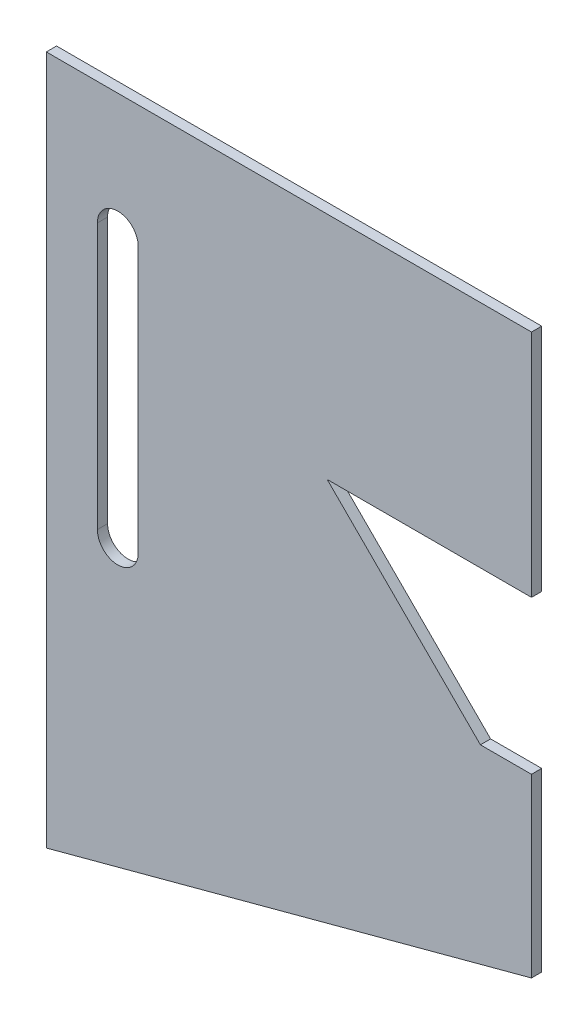
ISO-10303-21;
HEADER;
FILE_DESCRIPTION(('STEP AP214'),'2;1');
FILE_NAME('part.step','',(''),(''),'','','');
FILE_SCHEMA(('AUTOMOTIVE_DESIGN { 1 0 10303 214 1 1 1 1 }'));
ENDSEC;
DATA;
#1=APPLICATION_CONTEXT('core data for automotive mechanical design processes');
#2=APPLICATION_PROTOCOL_DEFINITION('international standard','automotive_design',2000,#1);
#3=PRODUCT_CONTEXT('',#1,'mechanical');
#4=PRODUCT('Part','Part','',(#3));
#5=PRODUCT_RELATED_PRODUCT_CATEGORY('part','',(#4));
#6=PRODUCT_DEFINITION_FORMATION('','',#4);
#7=PRODUCT_DEFINITION_CONTEXT('part definition',#1,'design');
#8=PRODUCT_DEFINITION('design','',#6,#7);
#9=PRODUCT_DEFINITION_SHAPE('','',#8);
#10=(LENGTH_UNIT() NAMED_UNIT(*) SI_UNIT(.MILLI.,.METRE.));
#11=(NAMED_UNIT(*) PLANE_ANGLE_UNIT() SI_UNIT($,.RADIAN.));
#12=(NAMED_UNIT(*) SI_UNIT($,.STERADIAN.) SOLID_ANGLE_UNIT());
#13=UNCERTAINTY_MEASURE_WITH_UNIT(LENGTH_MEASURE(1.E-05),#10,'distance_accuracy_value','');
#14=(GEOMETRIC_REPRESENTATION_CONTEXT(3) GLOBAL_UNCERTAINTY_ASSIGNED_CONTEXT((#13)) GLOBAL_UNIT_ASSIGNED_CONTEXT((#10,
#11,#12)) REPRESENTATION_CONTEXT('',''));
#15=CARTESIAN_POINT('',(0.,0.,0.));
#16=DIRECTION('',(0.,0.,1.));
#17=DIRECTION('',(1.,0.,0.));
#18=AXIS2_PLACEMENT_3D('',#15,#16,#17);
#19=CARTESIAN_POINT('',(0.,0.,2.));
#20=DIRECTION('',(0.,0.,-1.));
#21=DIRECTION('',(-1.,0.,0.));
#22=AXIS2_PLACEMENT_3D('',#19,#20,#21);
#23=PLANE('',#22);
#24=DIRECTION('',(0.,-1.,0.));
#25=VECTOR('',#24,1.);
#26=CARTESIAN_POINT('',(0.,135.,2.));
#27=LINE('',#26,#25);
#28=CARTESIAN_POINT('',(0.,135.,2.));
#29=VERTEX_POINT('',#28);
#30=CARTESIAN_POINT('',(0.,0.,2.));
#31=VERTEX_POINT('',#30);
#32=EDGE_CURVE('E158',#29,#31,#27,.T.);
#33=ORIENTED_EDGE('',*,*,#32,.T.);
#34=DIRECTION('',(0.965925826289067,0.258819045102525,0.));
#35=VECTOR('',#34,1.);
#36=CARTESIAN_POINT('',(0.,0.,2.));
#37=LINE('',#36,#35);
#38=CARTESIAN_POINT('',(95.,25.4551732809571,2.));
#39=VERTEX_POINT('',#38);
#40=EDGE_CURVE('E161',#31,#39,#37,.T.);
#41=ORIENTED_EDGE('',*,*,#40,.T.);
#42=DIRECTION('',(0.,1.,0.));
#43=VECTOR('',#42,1.);
#44=CARTESIAN_POINT('',(95.,25.4551732809571,2.));
#45=LINE('',#44,#43);
#46=CARTESIAN_POINT('',(95.,60.,2.));
#47=VERTEX_POINT('',#46);
#48=EDGE_CURVE('E164',#39,#47,#45,.T.);
#49=ORIENTED_EDGE('',*,*,#48,.T.);
#50=DIRECTION('',(-1.,0.,0.));
#51=VECTOR('',#50,1.);
#52=CARTESIAN_POINT('',(95.,60.,2.));
#53=LINE('',#52,#51);
#54=CARTESIAN_POINT('',(85.,60.,2.));
#55=VERTEX_POINT('',#54);
#56=EDGE_CURVE('E166',#47,#55,#53,.T.);
#57=ORIENTED_EDGE('',*,*,#56,.T.);
#58=DIRECTION('',(-0.707106781186548,0.707106781186547,0.));
#59=VECTOR('',#58,1.);
#60=CARTESIAN_POINT('',(85.,60.,2.));
#61=LINE('',#60,#59);
#62=CARTESIAN_POINT('',(55.,90.,2.));
#63=VERTEX_POINT('',#62);
#64=EDGE_CURVE('E168',#55,#63,#61,.T.);
#65=ORIENTED_EDGE('',*,*,#64,.T.);
#66=DIRECTION('',(1.,0.,0.));
#67=VECTOR('',#66,1.);
#68=CARTESIAN_POINT('',(55.,90.,2.));
#69=LINE('',#68,#67);
#70=CARTESIAN_POINT('',(95.,90.,2.));
#71=VERTEX_POINT('',#70);
#72=EDGE_CURVE('E170',#63,#71,#69,.T.);
#73=ORIENTED_EDGE('',*,*,#72,.T.);
#74=DIRECTION('',(0.,1.,0.));
#75=VECTOR('',#74,1.);
#76=CARTESIAN_POINT('',(95.,90.,2.));
#77=LINE('',#76,#75);
#78=CARTESIAN_POINT('',(95.,135.,2.));
#79=VERTEX_POINT('',#78);
#80=EDGE_CURVE('E172',#71,#79,#77,.T.);
#81=ORIENTED_EDGE('',*,*,#80,.T.);
#82=DIRECTION('',(-1.,0.,0.));
#83=VECTOR('',#82,1.);
#84=CARTESIAN_POINT('',(95.,135.,2.));
#85=LINE('',#84,#83);
#86=EDGE_CURVE('E174',#79,#29,#85,.T.);
#87=ORIENTED_EDGE('',*,*,#86,.T.);
#88=EDGE_LOOP('',(#33,#41,#49,#57,#65,#73,#81,#87));
#89=FACE_BOUND('',#88,.T.);
#90=CARTESIAN_POINT('',(14.,111.,2.));
#91=DIRECTION('',(0.,0.,1.));
#92=DIRECTION('',(1.,0.,0.));
#93=AXIS2_PLACEMENT_3D('',#90,#91,#92);
#94=CIRCLE('',#93,4.);
#95=CARTESIAN_POINT('',(18.,111.,2.));
#96=VERTEX_POINT('',#95);
#97=CARTESIAN_POINT('',(10.,111.,2.));
#98=VERTEX_POINT('',#97);
#99=EDGE_CURVE('E122',#96,#98,#94,.T.);
#100=ORIENTED_EDGE('',*,*,#99,.F.);
#101=DIRECTION('',(0.,1.,0.));
#102=VECTOR('',#101,1.);
#103=CARTESIAN_POINT('',(18.,111.,2.));
#104=LINE('',#103,#102);
#105=CARTESIAN_POINT('',(18.,59.,2.));
#106=VERTEX_POINT('',#105);
#107=EDGE_CURVE('E144',#106,#96,#104,.T.);
#108=ORIENTED_EDGE('',*,*,#107,.F.);
#109=CARTESIAN_POINT('',(14.,59.,2.));
#110=DIRECTION('',(0.,0.,1.));
#111=DIRECTION('',(1.,0.,0.));
#112=AXIS2_PLACEMENT_3D('',#109,#110,#111);
#113=CIRCLE('',#112,4.);
#114=CARTESIAN_POINT('',(10.,59.,2.));
#115=VERTEX_POINT('',#114);
#116=EDGE_CURVE('E142',#115,#106,#113,.T.);
#117=ORIENTED_EDGE('',*,*,#116,.F.);
#118=DIRECTION('',(0.,-1.,0.));
#119=VECTOR('',#118,1.);
#120=CARTESIAN_POINT('',(10.,111.,2.));
#121=LINE('',#120,#119);
#122=EDGE_CURVE('E130',#98,#115,#121,.T.);
#123=ORIENTED_EDGE('',*,*,#122,.F.);
#124=EDGE_LOOP('',(#100,#108,#117,#123));
#125=FACE_BOUND('',#124,.T.);
#126=ADVANCED_FACE('F33',(#89,#125),#23,.F.);
#127=CARTESIAN_POINT('',(0.,0.,0.));
#128=DIRECTION('',(0.,0.,-1.));
#129=DIRECTION('',(-1.,0.,0.));
#130=AXIS2_PLACEMENT_3D('',#127,#128,#129);
#131=PLANE('',#130);
#132=DIRECTION('',(0.,-1.,0.));
#133=VECTOR('',#132,1.);
#134=CARTESIAN_POINT('',(0.,135.,0.));
#135=LINE('',#134,#133);
#136=CARTESIAN_POINT('',(0.,135.,0.));
#137=VERTEX_POINT('',#136);
#138=CARTESIAN_POINT('',(0.,0.,0.));
#139=VERTEX_POINT('',#138);
#140=EDGE_CURVE('E138',#137,#139,#135,.T.);
#141=ORIENTED_EDGE('',*,*,#140,.F.);
#142=DIRECTION('',(-1.,0.,0.));
#143=VECTOR('',#142,1.);
#144=CARTESIAN_POINT('',(95.,135.,0.));
#145=LINE('',#144,#143);
#146=CARTESIAN_POINT('',(95.,135.,0.));
#147=VERTEX_POINT('',#146);
#148=EDGE_CURVE('E162',#147,#137,#145,.T.);
#149=ORIENTED_EDGE('',*,*,#148,.F.);
#150=DIRECTION('',(0.,1.,0.));
#151=VECTOR('',#150,1.);
#152=CARTESIAN_POINT('',(95.,90.,0.));
#153=LINE('',#152,#151);
#154=CARTESIAN_POINT('',(95.,90.,0.));
#155=VERTEX_POINT('',#154);
#156=EDGE_CURVE('E189',#155,#147,#153,.T.);
#157=ORIENTED_EDGE('',*,*,#156,.F.);
#158=DIRECTION('',(1.,0.,0.));
#159=VECTOR('',#158,1.);
#160=CARTESIAN_POINT('',(55.,90.,0.));
#161=LINE('',#160,#159);
#162=CARTESIAN_POINT('',(55.,90.,0.));
#163=VERTEX_POINT('',#162);
#164=EDGE_CURVE('E187',#163,#155,#161,.T.);
#165=ORIENTED_EDGE('',*,*,#164,.F.);
#166=DIRECTION('',(-0.707106781186548,0.707106781186547,0.));
#167=VECTOR('',#166,1.);
#168=CARTESIAN_POINT('',(85.,60.,0.));
#169=LINE('',#168,#167);
#170=CARTESIAN_POINT('',(85.,60.,0.));
#171=VERTEX_POINT('',#170);
#172=EDGE_CURVE('E185',#171,#163,#169,.T.);
#173=ORIENTED_EDGE('',*,*,#172,.F.);
#174=DIRECTION('',(-1.,0.,0.));
#175=VECTOR('',#174,1.);
#176=CARTESIAN_POINT('',(95.,60.,0.));
#177=LINE('',#176,#175);
#178=CARTESIAN_POINT('',(95.,60.,0.));
#179=VERTEX_POINT('',#178);
#180=EDGE_CURVE('E183',#179,#171,#177,.T.);
#181=ORIENTED_EDGE('',*,*,#180,.F.);
#182=DIRECTION('',(0.,1.,0.));
#183=VECTOR('',#182,1.);
#184=CARTESIAN_POINT('',(95.,25.4551732809571,0.));
#185=LINE('',#184,#183);
#186=CARTESIAN_POINT('',(95.,25.4551732809571,0.));
#187=VERTEX_POINT('',#186);
#188=EDGE_CURVE('E181',#187,#179,#185,.T.);
#189=ORIENTED_EDGE('',*,*,#188,.F.);
#190=DIRECTION('',(0.965925826289067,0.258819045102525,0.));
#191=VECTOR('',#190,1.);
#192=CARTESIAN_POINT('',(0.,0.,0.));
#193=LINE('',#192,#191);
#194=EDGE_CURVE('E179',#139,#187,#193,.T.);
#195=ORIENTED_EDGE('',*,*,#194,.F.);
#196=EDGE_LOOP('',(#141,#149,#157,#165,#173,#181,#189,#195));
#197=FACE_BOUND('',#196,.T.);
#198=DIRECTION('',(0.,1.,0.));
#199=VECTOR('',#198,1.);
#200=CARTESIAN_POINT('',(18.,111.,0.));
#201=LINE('',#200,#199);
#202=CARTESIAN_POINT('',(18.,59.,0.));
#203=VERTEX_POINT('',#202);
#204=CARTESIAN_POINT('',(18.,111.,0.));
#205=VERTEX_POINT('',#204);
#206=EDGE_CURVE('E131',#203,#205,#201,.T.);
#207=ORIENTED_EDGE('',*,*,#206,.T.);
#208=CARTESIAN_POINT('',(14.,111.,0.));
#209=DIRECTION('',(0.,0.,1.));
#210=DIRECTION('',(1.,0.,0.));
#211=AXIS2_PLACEMENT_3D('',#208,#209,#210);
#212=CIRCLE('',#211,4.);
#213=CARTESIAN_POINT('',(10.,111.,0.));
#214=VERTEX_POINT('',#213);
#215=EDGE_CURVE('E56',#205,#214,#212,.T.);
#216=ORIENTED_EDGE('',*,*,#215,.T.);
#217=DIRECTION('',(0.,-1.,0.));
#218=VECTOR('',#217,1.);
#219=CARTESIAN_POINT('',(10.,111.,0.));
#220=LINE('',#219,#218);
#221=CARTESIAN_POINT('',(10.,59.,0.));
#222=VERTEX_POINT('',#221);
#223=EDGE_CURVE('E137',#214,#222,#220,.T.);
#224=ORIENTED_EDGE('',*,*,#223,.T.);
#225=CARTESIAN_POINT('',(14.,59.,0.));
#226=DIRECTION('',(0.,0.,1.));
#227=DIRECTION('',(1.,0.,0.));
#228=AXIS2_PLACEMENT_3D('',#225,#226,#227);
#229=CIRCLE('',#228,4.);
#230=EDGE_CURVE('E150',#222,#203,#229,.T.);
#231=ORIENTED_EDGE('',*,*,#230,.T.);
#232=EDGE_LOOP('',(#207,#216,#224,#231));
#233=FACE_BOUND('',#232,.T.);
#234=ADVANCED_FACE('F219',(#197,#233),#131,.T.);
#235=CARTESIAN_POINT('',(0.,135.,2.));
#236=DIRECTION('',(1.,0.,0.));
#237=DIRECTION('',(0.,0.,-1.));
#238=AXIS2_PLACEMENT_3D('',#235,#236,#237);
#239=PLANE('',#238);
#240=ORIENTED_EDGE('',*,*,#140,.T.);
#241=DIRECTION('',(0.,0.,-1.));
#242=VECTOR('',#241,1.);
#243=CARTESIAN_POINT('',(0.,0.,2.));
#244=LINE('',#243,#242);
#245=EDGE_CURVE('E11',#31,#139,#244,.T.);
#246=ORIENTED_EDGE('',*,*,#245,.F.);
#247=ORIENTED_EDGE('',*,*,#32,.F.);
#248=DIRECTION('',(0.,0.,-1.));
#249=VECTOR('',#248,1.);
#250=CARTESIAN_POINT('',(0.,135.,2.));
#251=LINE('',#250,#249);
#252=EDGE_CURVE('E176',#29,#137,#251,.T.);
#253=ORIENTED_EDGE('',*,*,#252,.T.);
#254=EDGE_LOOP('',(#240,#246,#247,#253));
#255=FACE_BOUND('',#254,.T.);
#256=ADVANCED_FACE('F35',(#255),#239,.F.);
#257=CARTESIAN_POINT('',(0.,0.,2.));
#258=DIRECTION('',(-0.258819045102525,0.965925826289067,0.));
#259=DIRECTION('',(-0.965925826289067,-0.258819045102525,0.));
#260=AXIS2_PLACEMENT_3D('',#257,#258,#259);
#261=PLANE('',#260);
#262=ORIENTED_EDGE('',*,*,#194,.T.);
#263=DIRECTION('',(0.,0.,-1.));
#264=VECTOR('',#263,1.);
#265=CARTESIAN_POINT('',(95.,25.4551732809571,2.));
#266=LINE('',#265,#264);
#267=EDGE_CURVE('E41',#39,#187,#266,.T.);
#268=ORIENTED_EDGE('',*,*,#267,.F.);
#269=ORIENTED_EDGE('',*,*,#40,.F.);
#270=ORIENTED_EDGE('',*,*,#245,.T.);
#271=EDGE_LOOP('',(#262,#268,#269,#270));
#272=FACE_BOUND('',#271,.T.);
#273=ADVANCED_FACE('F236',(#272),#261,.F.);
#274=CARTESIAN_POINT('',(95.,25.4551732809571,2.));
#275=DIRECTION('',(-1.,0.,0.));
#276=DIRECTION('',(0.,0.,1.));
#277=AXIS2_PLACEMENT_3D('',#274,#275,#276);
#278=PLANE('',#277);
#279=ORIENTED_EDGE('',*,*,#188,.T.);
#280=DIRECTION('',(0.,0.,-1.));
#281=VECTOR('',#280,1.);
#282=CARTESIAN_POINT('',(95.,60.,2.));
#283=LINE('',#282,#281);
#284=EDGE_CURVE('E206',#47,#179,#283,.T.);
#285=ORIENTED_EDGE('',*,*,#284,.F.);
#286=ORIENTED_EDGE('',*,*,#48,.F.);
#287=ORIENTED_EDGE('',*,*,#267,.T.);
#288=EDGE_LOOP('',(#279,#285,#286,#287));
#289=FACE_BOUND('',#288,.T.);
#290=ADVANCED_FACE('F213',(#289),#278,.F.);
#291=CARTESIAN_POINT('',(95.,60.,2.));
#292=DIRECTION('',(0.,-1.,0.));
#293=DIRECTION('',(0.,0.,-1.));
#294=AXIS2_PLACEMENT_3D('',#291,#292,#293);
#295=PLANE('',#294);
#296=ORIENTED_EDGE('',*,*,#180,.T.);
#297=DIRECTION('',(0.,0.,-1.));
#298=VECTOR('',#297,1.);
#299=CARTESIAN_POINT('',(85.,60.,2.));
#300=LINE('',#299,#298);
#301=EDGE_CURVE('E203',#55,#171,#300,.T.);
#302=ORIENTED_EDGE('',*,*,#301,.F.);
#303=ORIENTED_EDGE('',*,*,#56,.F.);
#304=ORIENTED_EDGE('',*,*,#284,.T.);
#305=EDGE_LOOP('',(#296,#302,#303,#304));
#306=FACE_BOUND('',#305,.T.);
#307=ADVANCED_FACE('F225',(#306),#295,.F.);
#308=CARTESIAN_POINT('',(85.,60.,2.));
#309=DIRECTION('',(-0.707106781186547,-0.707106781186548,0.));
#310=DIRECTION('',(0.707106781186548,-0.707106781186547,0.));
#311=AXIS2_PLACEMENT_3D('',#308,#309,#310);
#312=PLANE('',#311);
#313=ORIENTED_EDGE('',*,*,#172,.T.);
#314=DIRECTION('',(0.,0.,-1.));
#315=VECTOR('',#314,1.);
#316=CARTESIAN_POINT('',(55.,90.,2.));
#317=LINE('',#316,#315);
#318=EDGE_CURVE('E200',#63,#163,#317,.T.);
#319=ORIENTED_EDGE('',*,*,#318,.F.);
#320=ORIENTED_EDGE('',*,*,#64,.F.);
#321=ORIENTED_EDGE('',*,*,#301,.T.);
#322=EDGE_LOOP('',(#313,#319,#320,#321));
#323=FACE_BOUND('',#322,.T.);
#324=ADVANCED_FACE('F229',(#323),#312,.F.);
#325=CARTESIAN_POINT('',(55.,90.,2.));
#326=DIRECTION('',(0.,1.,0.));
#327=DIRECTION('',(0.,0.,1.));
#328=AXIS2_PLACEMENT_3D('',#325,#326,#327);
#329=PLANE('',#328);
#330=ORIENTED_EDGE('',*,*,#164,.T.);
#331=DIRECTION('',(0.,0.,-1.));
#332=VECTOR('',#331,1.);
#333=CARTESIAN_POINT('',(95.,90.,2.));
#334=LINE('',#333,#332);
#335=EDGE_CURVE('E197',#71,#155,#334,.T.);
#336=ORIENTED_EDGE('',*,*,#335,.F.);
#337=ORIENTED_EDGE('',*,*,#72,.F.);
#338=ORIENTED_EDGE('',*,*,#318,.T.);
#339=EDGE_LOOP('',(#330,#336,#337,#338));
#340=FACE_BOUND('',#339,.T.);
#341=ADVANCED_FACE('F249',(#340),#329,.F.);
#342=CARTESIAN_POINT('',(95.,90.,2.));
#343=DIRECTION('',(-1.,0.,0.));
#344=DIRECTION('',(0.,0.,1.));
#345=AXIS2_PLACEMENT_3D('',#342,#343,#344);
#346=PLANE('',#345);
#347=ORIENTED_EDGE('',*,*,#156,.T.);
#348=DIRECTION('',(0.,0.,-1.));
#349=VECTOR('',#348,1.);
#350=CARTESIAN_POINT('',(95.,135.,2.));
#351=LINE('',#350,#349);
#352=EDGE_CURVE('E194',#79,#147,#351,.T.);
#353=ORIENTED_EDGE('',*,*,#352,.F.);
#354=ORIENTED_EDGE('',*,*,#80,.F.);
#355=ORIENTED_EDGE('',*,*,#335,.T.);
#356=EDGE_LOOP('',(#347,#353,#354,#355));
#357=FACE_BOUND('',#356,.T.);
#358=ADVANCED_FACE('F247',(#357),#346,.F.);
#359=CARTESIAN_POINT('',(95.,135.,2.));
#360=DIRECTION('',(0.,-1.,0.));
#361=DIRECTION('',(0.,0.,-1.));
#362=AXIS2_PLACEMENT_3D('',#359,#360,#361);
#363=PLANE('',#362);
#364=ORIENTED_EDGE('',*,*,#148,.T.);
#365=ORIENTED_EDGE('',*,*,#252,.F.);
#366=ORIENTED_EDGE('',*,*,#86,.F.);
#367=ORIENTED_EDGE('',*,*,#352,.T.);
#368=EDGE_LOOP('',(#364,#365,#366,#367));
#369=FACE_BOUND('',#368,.T.);
#370=ADVANCED_FACE('F242',(#369),#363,.F.);
#371=CARTESIAN_POINT('',(14.,111.,2.));
#372=DIRECTION('',(0.,0.,-1.));
#373=DIRECTION('',(-1.,0.,0.));
#374=AXIS2_PLACEMENT_3D('',#371,#372,#373);
#375=CYLINDRICAL_SURFACE('',#374,4.);
#376=ORIENTED_EDGE('',*,*,#215,.F.);
#377=DIRECTION('',(0.,0.,-1.));
#378=VECTOR('',#377,1.);
#379=CARTESIAN_POINT('',(18.,111.,2.));
#380=LINE('',#379,#378);
#381=EDGE_CURVE('E126',#96,#205,#380,.T.);
#382=ORIENTED_EDGE('',*,*,#381,.F.);
#383=ORIENTED_EDGE('',*,*,#99,.T.);
#384=DIRECTION('',(0.,0.,-1.));
#385=VECTOR('',#384,1.);
#386=CARTESIAN_POINT('',(10.,111.,2.));
#387=LINE('',#386,#385);
#388=EDGE_CURVE('E125',#98,#214,#387,.T.);
#389=ORIENTED_EDGE('',*,*,#388,.T.);
#390=EDGE_LOOP('',(#376,#382,#383,#389));
#391=FACE_BOUND('',#390,.T.);
#392=ADVANCED_FACE('F124',(#391),#375,.F.);
#393=CARTESIAN_POINT('',(10.,111.,2.));
#394=DIRECTION('',(1.,0.,0.));
#395=DIRECTION('',(0.,1.,0.));
#396=AXIS2_PLACEMENT_3D('',#393,#394,#395);
#397=PLANE('',#396);
#398=ORIENTED_EDGE('',*,*,#223,.F.);
#399=ORIENTED_EDGE('',*,*,#388,.F.);
#400=ORIENTED_EDGE('',*,*,#122,.T.);
#401=DIRECTION('',(0.,0.,-1.));
#402=VECTOR('',#401,1.);
#403=CARTESIAN_POINT('',(10.,59.,2.));
#404=LINE('',#403,#402);
#405=EDGE_CURVE('E139',#115,#222,#404,.T.);
#406=ORIENTED_EDGE('',*,*,#405,.T.);
#407=EDGE_LOOP('',(#398,#399,#400,#406));
#408=FACE_BOUND('',#407,.T.);
#409=ADVANCED_FACE('F134',(#408),#397,.T.);
#410=CARTESIAN_POINT('',(14.,59.,2.));
#411=DIRECTION('',(0.,0.,-1.));
#412=DIRECTION('',(-1.,0.,0.));
#413=AXIS2_PLACEMENT_3D('',#410,#411,#412);
#414=CYLINDRICAL_SURFACE('',#413,4.);
#415=ORIENTED_EDGE('',*,*,#230,.F.);
#416=ORIENTED_EDGE('',*,*,#405,.F.);
#417=ORIENTED_EDGE('',*,*,#116,.T.);
#418=DIRECTION('',(0.,0.,-1.));
#419=VECTOR('',#418,1.);
#420=CARTESIAN_POINT('',(18.,59.,2.));
#421=LINE('',#420,#419);
#422=EDGE_CURVE('E48',#106,#203,#421,.T.);
#423=ORIENTED_EDGE('',*,*,#422,.T.);
#424=EDGE_LOOP('',(#415,#416,#417,#423));
#425=FACE_BOUND('',#424,.T.);
#426=ADVANCED_FACE('F274',(#425),#414,.F.);
#427=CARTESIAN_POINT('',(18.,111.,2.));
#428=DIRECTION('',(-1.,0.,0.));
#429=DIRECTION('',(0.,-1.,0.));
#430=AXIS2_PLACEMENT_3D('',#427,#428,#429);
#431=PLANE('',#430);
#432=ORIENTED_EDGE('',*,*,#206,.F.);
#433=ORIENTED_EDGE('',*,*,#422,.F.);
#434=ORIENTED_EDGE('',*,*,#107,.T.);
#435=ORIENTED_EDGE('',*,*,#381,.T.);
#436=EDGE_LOOP('',(#432,#433,#434,#435));
#437=FACE_BOUND('',#436,.T.);
#438=ADVANCED_FACE('F278',(#437),#431,.T.);
#439=CLOSED_SHELL('',(#126,#234,#256,#273,#290,#307,#324,#341,#358,#370,#392,#409,#426,#438));
#440=MANIFOLD_SOLID_BREP('B2',#439);
#441=ADVANCED_BREP_SHAPE_REPRESENTATION('',(#18,#440),#14);
#442=SHAPE_DEFINITION_REPRESENTATION(#9,#441);
ENDSEC;
END-ISO-10303-21;
